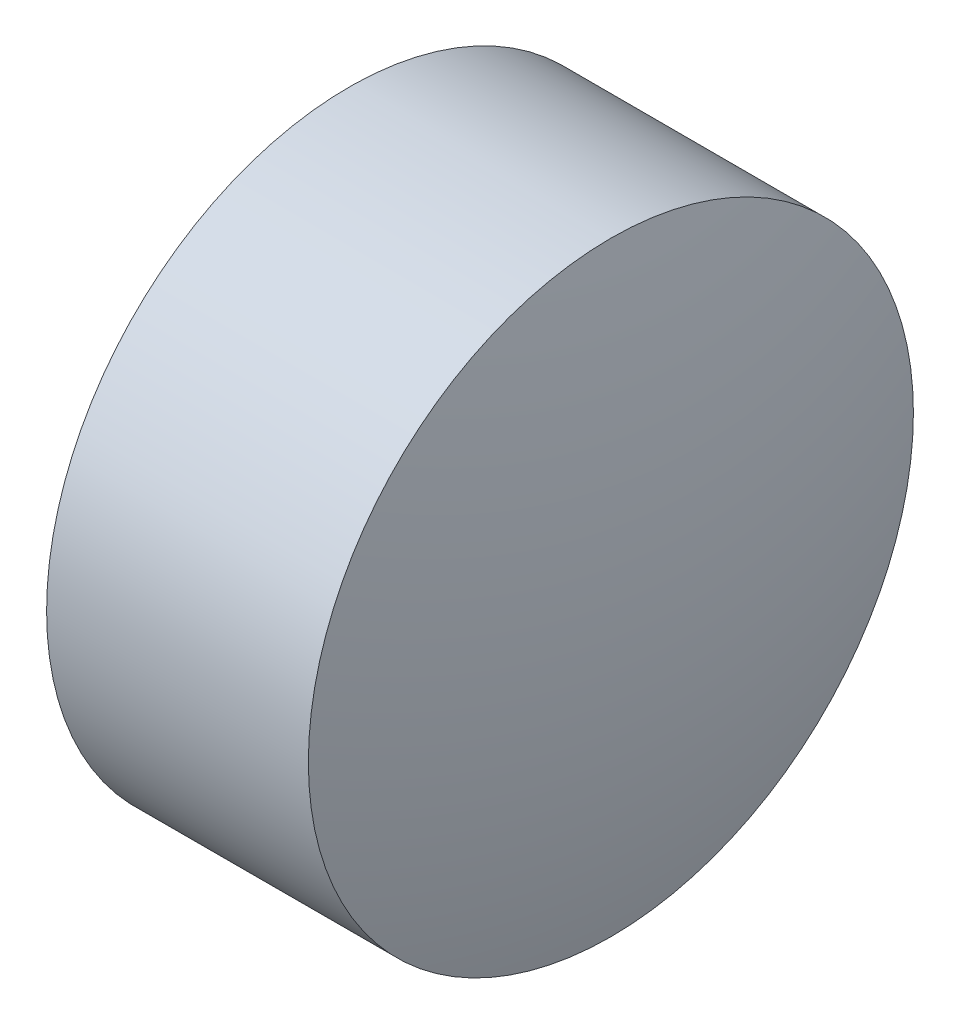
ISO-10303-21;
HEADER;
FILE_DESCRIPTION(('STEP AP214'),'2;1');
FILE_NAME('part.step','',(''),(''),'','','');
FILE_SCHEMA(('AUTOMOTIVE_DESIGN { 1 0 10303 214 1 1 1 1 }'));
ENDSEC;
DATA;
#1=APPLICATION_CONTEXT('core data for automotive mechanical design processes');
#2=APPLICATION_PROTOCOL_DEFINITION('international standard','automotive_design',2000,#1);
#3=PRODUCT_CONTEXT('',#1,'mechanical');
#4=PRODUCT('Part','Part','',(#3));
#5=PRODUCT_RELATED_PRODUCT_CATEGORY('part','',(#4));
#6=PRODUCT_DEFINITION_FORMATION('','',#4);
#7=PRODUCT_DEFINITION_CONTEXT('part definition',#1,'design');
#8=PRODUCT_DEFINITION('design','',#6,#7);
#9=PRODUCT_DEFINITION_SHAPE('','',#8);
#10=(LENGTH_UNIT() NAMED_UNIT(*) SI_UNIT(.MILLI.,.METRE.));
#11=(NAMED_UNIT(*) PLANE_ANGLE_UNIT() SI_UNIT($,.RADIAN.));
#12=(NAMED_UNIT(*) SI_UNIT($,.STERADIAN.) SOLID_ANGLE_UNIT());
#13=UNCERTAINTY_MEASURE_WITH_UNIT(LENGTH_MEASURE(1.E-05),#10,'distance_accuracy_value','');
#14=(GEOMETRIC_REPRESENTATION_CONTEXT(3) GLOBAL_UNCERTAINTY_ASSIGNED_CONTEXT((#13)) GLOBAL_UNIT_ASSIGNED_CONTEXT((#10,
#11,#12)) REPRESENTATION_CONTEXT('',''));
#15=CARTESIAN_POINT('',(0.,0.,0.));
#16=DIRECTION('',(0.,0.,1.));
#17=DIRECTION('',(1.,0.,0.));
#18=AXIS2_PLACEMENT_3D('',#15,#16,#17);
#19=CARTESIAN_POINT('',(-0.5,0.,0.));
#20=DIRECTION('',(1.,0.,0.));
#21=DIRECTION('',(0.,0.,-1.));
#22=AXIS2_PLACEMENT_3D('',#19,#20,#21);
#23=PLANE('',#22);
#24=CARTESIAN_POINT('',(-0.5,0.,0.));
#25=DIRECTION('',(-1.,0.,0.));
#26=DIRECTION('',(0.,0.,1.));
#27=AXIS2_PLACEMENT_3D('',#24,#25,#26);
#28=CIRCLE('',#27,1.);
#29=CARTESIAN_POINT('',(-0.5,0.,1.));
#30=VERTEX_POINT('',#29);
#31=EDGE_CURVE('E36',#30,#30,#28,.T.);
#32=ORIENTED_EDGE('',*,*,#31,.T.);
#33=EDGE_LOOP('',(#32));
#34=FACE_BOUND('',#33,.T.);
#35=ADVANCED_FACE('F30',(#34),#23,.F.);
#36=CARTESIAN_POINT('',(-3.278,0.,0.));
#37=DIRECTION('',(-1.,0.,0.));
#38=DIRECTION('',(0.,1.,0.));
#39=AXIS2_PLACEMENT_3D('',#36,#37,#38);
#40=SPHERICAL_SURFACE('',#39,3.778);
#41=CARTESIAN_POINT('',(0.365251844163398,0.,0.));
#42=DIRECTION('',(-1.,0.,0.));
#43=DIRECTION('',(0.,0.,1.));
#44=AXIS2_PLACEMENT_3D('',#41,#42,#43);
#45=CIRCLE('',#44,1.);
#46=CARTESIAN_POINT('',(0.365251844163398,0.,1.));
#47=VERTEX_POINT('',#46);
#48=EDGE_CURVE('E10',#47,#47,#45,.T.);
#49=ORIENTED_EDGE('',*,*,#48,.F.);
#50=EDGE_LOOP('',(#49));
#51=FACE_BOUND('',#50,.T.);
#52=ADVANCED_FACE('F45',(#51),#40,.T.);
#53=CARTESIAN_POINT('',(-0.5,0.,0.));
#54=DIRECTION('',(-1.,0.,0.));
#55=DIRECTION('',(0.,0.,1.));
#56=AXIS2_PLACEMENT_3D('',#53,#54,#55);
#57=CYLINDRICAL_SURFACE('',#56,1.);
#58=ORIENTED_EDGE('',*,*,#31,.F.);
#59=EDGE_LOOP('',(#58));
#60=FACE_BOUND('',#59,.T.);
#61=ORIENTED_EDGE('',*,*,#48,.T.);
#62=EDGE_LOOP('',(#61));
#63=FACE_BOUND('',#62,.T.);
#64=ADVANCED_FACE('F43',(#60,#63),#57,.T.);
#65=CLOSED_SHELL('',(#35,#52,#64));
#66=MANIFOLD_SOLID_BREP('B2',#65);
#67=ADVANCED_BREP_SHAPE_REPRESENTATION('',(#18,#66),#14);
#68=SHAPE_DEFINITION_REPRESENTATION(#9,#67);
ENDSEC;
END-ISO-10303-21;
